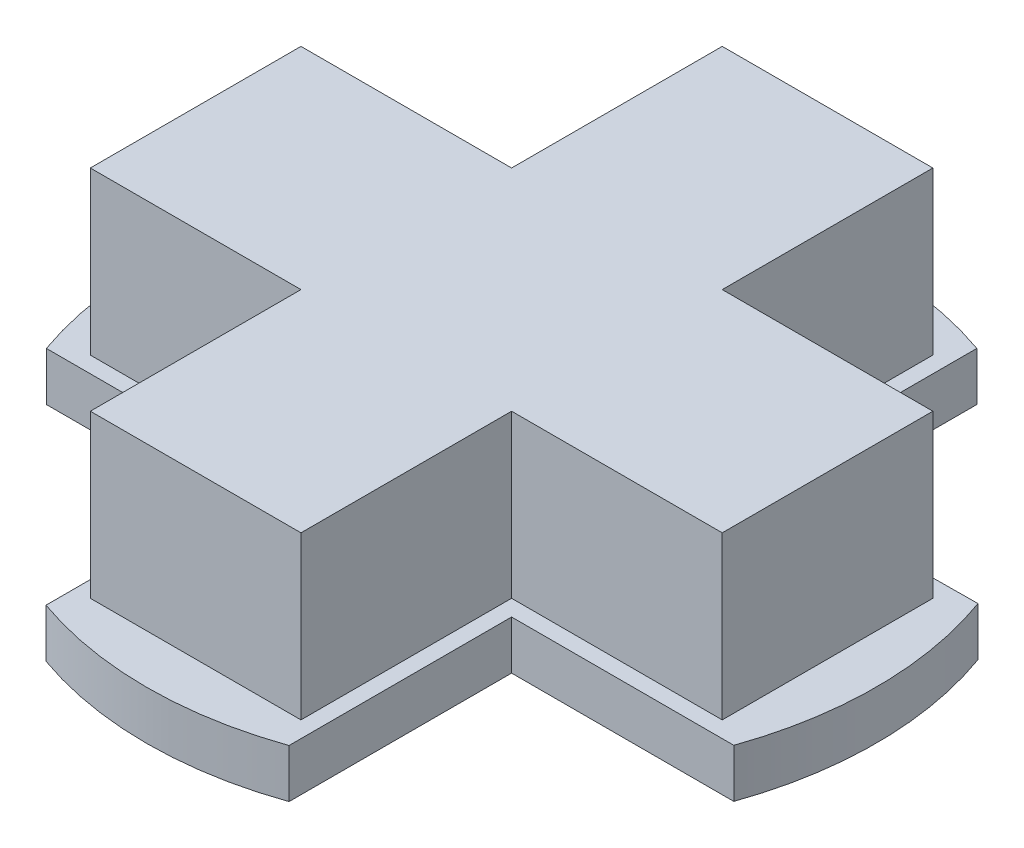
ISO-10303-21;
HEADER;
FILE_DESCRIPTION(('STEP AP214'),'2;1');
FILE_NAME('part.step','',(''),(''),'','','');
FILE_SCHEMA(('AUTOMOTIVE_DESIGN { 1 0 10303 214 1 1 1 1 }'));
ENDSEC;
DATA;
#1=APPLICATION_CONTEXT('core data for automotive mechanical design processes');
#2=APPLICATION_PROTOCOL_DEFINITION('international standard','automotive_design',2000,#1);
#3=PRODUCT_CONTEXT('',#1,'mechanical');
#4=PRODUCT('Part','Part','',(#3));
#5=PRODUCT_RELATED_PRODUCT_CATEGORY('part','',(#4));
#6=PRODUCT_DEFINITION_FORMATION('','',#4);
#7=PRODUCT_DEFINITION_CONTEXT('part definition',#1,'design');
#8=PRODUCT_DEFINITION('design','',#6,#7);
#9=PRODUCT_DEFINITION_SHAPE('','',#8);
#10=(LENGTH_UNIT() NAMED_UNIT(*) SI_UNIT(.MILLI.,.METRE.));
#11=(NAMED_UNIT(*) PLANE_ANGLE_UNIT() SI_UNIT($,.RADIAN.));
#12=(NAMED_UNIT(*) SI_UNIT($,.STERADIAN.) SOLID_ANGLE_UNIT());
#13=UNCERTAINTY_MEASURE_WITH_UNIT(LENGTH_MEASURE(1.E-05),#10,'distance_accuracy_value','');
#14=(GEOMETRIC_REPRESENTATION_CONTEXT(3) GLOBAL_UNCERTAINTY_ASSIGNED_CONTEXT((#13)) GLOBAL_UNIT_ASSIGNED_CONTEXT((#10,
#11,#12)) REPRESENTATION_CONTEXT('',''));
#15=CARTESIAN_POINT('',(0.,0.,0.));
#16=DIRECTION('',(0.,0.,1.));
#17=DIRECTION('',(1.,0.,0.));
#18=AXIS2_PLACEMENT_3D('',#15,#16,#17);
#19=CARTESIAN_POINT('',(0.,1.8,0.));
#20=DIRECTION('',(0.,1.,0.));
#21=DIRECTION('',(0.,0.,1.));
#22=AXIS2_PLACEMENT_3D('',#19,#20,#21);
#23=PLANE('',#22);
#24=CARTESIAN_POINT('',(0.,1.8,0.));
#25=DIRECTION('',(0.,1.,0.));
#26=DIRECTION('',(0.,0.,1.));
#27=AXIS2_PLACEMENT_3D('',#24,#25,#26);
#28=CIRCLE('',#27,13.5);
#29=CARTESIAN_POINT('',(-12.7279220613579,1.8,-4.5));
#30=VERTEX_POINT('',#29);
#31=CARTESIAN_POINT('',(-12.7279220613579,1.8,4.5));
#32=VERTEX_POINT('',#31);
#33=EDGE_CURVE('E109',#30,#32,#28,.T.);
#34=ORIENTED_EDGE('',*,*,#33,.T.);
#35=DIRECTION('',(-1.,0.,0.));
#36=VECTOR('',#35,1.);
#37=CARTESIAN_POINT('',(-4.5,1.8,4.5));
#38=LINE('',#37,#36);
#39=CARTESIAN_POINT('',(-4.5,1.8,4.5));
#40=VERTEX_POINT('',#39);
#41=EDGE_CURVE('E238',#40,#32,#38,.T.);
#42=ORIENTED_EDGE('',*,*,#41,.F.);
#43=DIRECTION('',(0.,0.,-1.));
#44=VECTOR('',#43,1.);
#45=CARTESIAN_POINT('',(-4.5,1.8,12.741400861865));
#46=LINE('',#45,#44);
#47=CARTESIAN_POINT('',(-4.50000000000001,1.8,12.741400861865));
#48=VERTEX_POINT('',#47);
#49=EDGE_CURVE('E221',#48,#40,#46,.T.);
#50=ORIENTED_EDGE('',*,*,#49,.F.);
#51=CARTESIAN_POINT('',(0.,1.8,0.));
#52=DIRECTION('',(0.,1.,0.));
#53=DIRECTION('',(0.,0.,1.));
#54=AXIS2_PLACEMENT_3D('',#51,#52,#53);
#55=CIRCLE('',#54,13.512708681931);
#56=CARTESIAN_POINT('',(4.5,1.8,12.741400861865));
#57=VERTEX_POINT('',#56);
#58=EDGE_CURVE('E234',#48,#57,#55,.T.);
#59=ORIENTED_EDGE('',*,*,#58,.T.);
#60=DIRECTION('',(0.,0.,1.));
#61=VECTOR('',#60,1.);
#62=CARTESIAN_POINT('',(4.5,1.8,4.5));
#63=LINE('',#62,#61);
#64=CARTESIAN_POINT('',(4.5,1.8,4.5));
#65=VERTEX_POINT('',#64);
#66=EDGE_CURVE('E236',#65,#57,#63,.T.);
#67=ORIENTED_EDGE('',*,*,#66,.F.);
#68=DIRECTION('',(-1.,0.,0.));
#69=VECTOR('',#68,1.);
#70=CARTESIAN_POINT('',(12.7279220613579,1.8,4.5));
#71=LINE('',#70,#69);
#72=CARTESIAN_POINT('',(12.7279220613579,1.8,4.5));
#73=VERTEX_POINT('',#72);
#74=EDGE_CURVE('E244',#73,#65,#71,.T.);
#75=ORIENTED_EDGE('',*,*,#74,.F.);
#76=CARTESIAN_POINT('',(0.,1.8,0.));
#77=DIRECTION('',(0.,1.,0.));
#78=DIRECTION('',(0.,0.,1.));
#79=AXIS2_PLACEMENT_3D('',#76,#77,#78);
#80=CIRCLE('',#79,13.5);
#81=CARTESIAN_POINT('',(12.7038365936549,1.8,-4.56755249578098));
#82=VERTEX_POINT('',#81);
#83=EDGE_CURVE('E247',#73,#82,#80,.T.);
#84=ORIENTED_EDGE('',*,*,#83,.T.);
#85=DIRECTION('',(0.999966100232827,0.,-0.00823397748065216));
#86=VECTOR('',#85,1.);
#87=CARTESIAN_POINT('',(4.5,1.8,-4.5));
#88=LINE('',#87,#86);
#89=CARTESIAN_POINT('',(4.5,1.8,-4.5));
#90=VERTEX_POINT('',#89);
#91=EDGE_CURVE('E249',#90,#82,#88,.T.);
#92=ORIENTED_EDGE('',*,*,#91,.F.);
#93=DIRECTION('',(0.,0.,1.));
#94=VECTOR('',#93,1.);
#95=CARTESIAN_POINT('',(4.5,1.8,-12.7279220613579));
#96=LINE('',#95,#94);
#97=CARTESIAN_POINT('',(4.5,1.8,-12.7279220613579));
#98=VERTEX_POINT('',#97);
#99=EDGE_CURVE('E148',#98,#90,#96,.T.);
#100=ORIENTED_EDGE('',*,*,#99,.F.);
#101=CARTESIAN_POINT('',(0.,1.8,0.));
#102=DIRECTION('',(0.,1.,0.));
#103=DIRECTION('',(0.,0.,1.));
#104=AXIS2_PLACEMENT_3D('',#101,#102,#103);
#105=CIRCLE('',#104,13.5);
#106=CARTESIAN_POINT('',(-4.5,1.8,-12.7279220613579));
#107=VERTEX_POINT('',#106);
#108=EDGE_CURVE('E141',#98,#107,#105,.T.);
#109=ORIENTED_EDGE('',*,*,#108,.T.);
#110=DIRECTION('',(0.,0.,-1.));
#111=VECTOR('',#110,1.);
#112=CARTESIAN_POINT('',(-4.5,1.8,-4.5));
#113=LINE('',#112,#111);
#114=CARTESIAN_POINT('',(-4.5,1.8,-4.5));
#115=VERTEX_POINT('',#114);
#116=EDGE_CURVE('E145',#115,#107,#113,.T.);
#117=ORIENTED_EDGE('',*,*,#116,.F.);
#118=DIRECTION('',(1.,0.,0.));
#119=VECTOR('',#118,1.);
#120=CARTESIAN_POINT('',(-12.7279220613579,1.8,-4.5));
#121=LINE('',#120,#119);
#122=EDGE_CURVE('E163',#30,#115,#121,.T.);
#123=ORIENTED_EDGE('',*,*,#122,.F.);
#124=EDGE_LOOP('',(#34,#42,#50,#59,#67,#75,#84,#92,#100,#109,#117,#123));
#125=FACE_BOUND('',#124,.T.);
#126=DIRECTION('',(1.,0.,0.));
#127=VECTOR('',#126,1.);
#128=CARTESIAN_POINT('',(3.9,1.8,3.9));
#129=LINE('',#128,#127);
#130=CARTESIAN_POINT('',(3.9,1.8,3.9));
#131=VERTEX_POINT('',#130);
#132=CARTESIAN_POINT('',(11.7,1.8,3.9));
#133=VERTEX_POINT('',#132);
#134=EDGE_CURVE('E407',#131,#133,#129,.T.);
#135=ORIENTED_EDGE('',*,*,#134,.F.);
#136=DIRECTION('',(0.,0.,-1.));
#137=VECTOR('',#136,1.);
#138=CARTESIAN_POINT('',(3.9,1.8,11.7));
#139=LINE('',#138,#137);
#140=CARTESIAN_POINT('',(3.9,1.8,11.7));
#141=VERTEX_POINT('',#140);
#142=EDGE_CURVE('E345',#141,#131,#139,.T.);
#143=ORIENTED_EDGE('',*,*,#142,.F.);
#144=DIRECTION('',(1.,0.,0.));
#145=VECTOR('',#144,1.);
#146=CARTESIAN_POINT('',(3.9,1.8,11.7));
#147=LINE('',#146,#145);
#148=CARTESIAN_POINT('',(-3.9,1.8,11.7));
#149=VERTEX_POINT('',#148);
#150=EDGE_CURVE('E339',#149,#141,#147,.T.);
#151=ORIENTED_EDGE('',*,*,#150,.F.);
#152=DIRECTION('',(0.,0.,1.));
#153=VECTOR('',#152,1.);
#154=CARTESIAN_POINT('',(-3.9,1.8,3.9));
#155=LINE('',#154,#153);
#156=CARTESIAN_POINT('',(-3.9,1.8,3.9));
#157=VERTEX_POINT('',#156);
#158=EDGE_CURVE('E381',#157,#149,#155,.T.);
#159=ORIENTED_EDGE('',*,*,#158,.F.);
#160=DIRECTION('',(1.,0.,0.));
#161=VECTOR('',#160,1.);
#162=CARTESIAN_POINT('',(-11.7,1.8,3.9));
#163=LINE('',#162,#161);
#164=CARTESIAN_POINT('',(-11.7,1.8,3.9));
#165=VERTEX_POINT('',#164);
#166=EDGE_CURVE('E383',#165,#157,#163,.T.);
#167=ORIENTED_EDGE('',*,*,#166,.F.);
#168=DIRECTION('',(0.,0.,1.));
#169=VECTOR('',#168,1.);
#170=CARTESIAN_POINT('',(-11.7,1.8,3.9));
#171=LINE('',#170,#169);
#172=CARTESIAN_POINT('',(-11.7,1.8,-3.9));
#173=VERTEX_POINT('',#172);
#174=EDGE_CURVE('E386',#173,#165,#171,.T.);
#175=ORIENTED_EDGE('',*,*,#174,.F.);
#176=DIRECTION('',(-1.,0.,0.));
#177=VECTOR('',#176,1.);
#178=CARTESIAN_POINT('',(-3.9,1.8,-3.9));
#179=LINE('',#178,#177);
#180=CARTESIAN_POINT('',(-3.9,1.8,-3.9));
#181=VERTEX_POINT('',#180);
#182=EDGE_CURVE('E389',#181,#173,#179,.T.);
#183=ORIENTED_EDGE('',*,*,#182,.F.);
#184=DIRECTION('',(0.,0.,1.));
#185=VECTOR('',#184,1.);
#186=CARTESIAN_POINT('',(-3.9,1.8,-11.7));
#187=LINE('',#186,#185);
#188=CARTESIAN_POINT('',(-3.9,1.8,-11.7));
#189=VERTEX_POINT('',#188);
#190=EDGE_CURVE('E392',#189,#181,#187,.T.);
#191=ORIENTED_EDGE('',*,*,#190,.F.);
#192=DIRECTION('',(-1.,0.,0.));
#193=VECTOR('',#192,1.);
#194=CARTESIAN_POINT('',(-3.9,1.8,-11.7));
#195=LINE('',#194,#193);
#196=CARTESIAN_POINT('',(3.9,1.8,-11.7));
#197=VERTEX_POINT('',#196);
#198=EDGE_CURVE('E395',#197,#189,#195,.T.);
#199=ORIENTED_EDGE('',*,*,#198,.F.);
#200=DIRECTION('',(0.,0.,-1.));
#201=VECTOR('',#200,1.);
#202=CARTESIAN_POINT('',(3.9,1.8,-3.9));
#203=LINE('',#202,#201);
#204=CARTESIAN_POINT('',(3.9,1.8,-3.9));
#205=VERTEX_POINT('',#204);
#206=EDGE_CURVE('E398',#205,#197,#203,.T.);
#207=ORIENTED_EDGE('',*,*,#206,.F.);
#208=DIRECTION('',(-1.,0.,0.));
#209=VECTOR('',#208,1.);
#210=CARTESIAN_POINT('',(11.7,1.8,-3.9));
#211=LINE('',#210,#209);
#212=CARTESIAN_POINT('',(11.7,1.8,-3.9));
#213=VERTEX_POINT('',#212);
#214=EDGE_CURVE('E401',#213,#205,#211,.T.);
#215=ORIENTED_EDGE('',*,*,#214,.F.);
#216=DIRECTION('',(0.,0.,-1.));
#217=VECTOR('',#216,1.);
#218=CARTESIAN_POINT('',(11.7,1.8,-3.9));
#219=LINE('',#218,#217);
#220=EDGE_CURVE('E404',#133,#213,#219,.T.);
#221=ORIENTED_EDGE('',*,*,#220,.F.);
#222=EDGE_LOOP('',(#135,#143,#151,#159,#167,#175,#183,#191,#199,#207,#215,#221));
#223=FACE_BOUND('',#222,.T.);
#224=ADVANCED_FACE('F35',(#125,#223),#23,.T.);
#225=CARTESIAN_POINT('',(0.,1.8,0.));
#226=DIRECTION('',(0.,-1.,0.));
#227=DIRECTION('',(0.,0.,-1.));
#228=AXIS2_PLACEMENT_3D('',#225,#226,#227);
#229=CYLINDRICAL_SURFACE('',#228,13.5);
#230=CARTESIAN_POINT('',(0.,0.,0.));
#231=DIRECTION('',(0.,1.,0.));
#232=DIRECTION('',(0.,0.,1.));
#233=AXIS2_PLACEMENT_3D('',#230,#231,#232);
#234=CIRCLE('',#233,13.5);
#235=CARTESIAN_POINT('',(-12.7279220613579,0.,-4.5));
#236=VERTEX_POINT('',#235);
#237=CARTESIAN_POINT('',(-12.7279220613579,0.,4.5));
#238=VERTEX_POINT('',#237);
#239=EDGE_CURVE('E168',#236,#238,#234,.T.);
#240=ORIENTED_EDGE('',*,*,#239,.T.);
#241=DIRECTION('',(0.,-1.,0.));
#242=VECTOR('',#241,1.);
#243=CARTESIAN_POINT('',(-12.7279220613579,1.8,4.5));
#244=LINE('',#243,#242);
#245=EDGE_CURVE('E11',#32,#238,#244,.T.);
#246=ORIENTED_EDGE('',*,*,#245,.F.);
#247=ORIENTED_EDGE('',*,*,#33,.F.);
#248=DIRECTION('',(0.,-1.,0.));
#249=VECTOR('',#248,1.);
#250=CARTESIAN_POINT('',(-12.7279220613579,1.8,-4.5));
#251=LINE('',#250,#249);
#252=EDGE_CURVE('E59',#30,#236,#251,.T.);
#253=ORIENTED_EDGE('',*,*,#252,.T.);
#254=EDGE_LOOP('',(#240,#246,#247,#253));
#255=FACE_BOUND('',#254,.T.);
#256=ADVANCED_FACE('F37',(#255),#229,.T.);
#257=CARTESIAN_POINT('',(-4.5,1.8,4.5));
#258=DIRECTION('',(0.,0.,1.));
#259=DIRECTION('',(1.,0.,0.));
#260=AXIS2_PLACEMENT_3D('',#257,#258,#259);
#261=PLANE('',#260);
#262=DIRECTION('',(-1.,0.,0.));
#263=VECTOR('',#262,1.);
#264=CARTESIAN_POINT('',(-4.5,0.,4.5));
#265=LINE('',#264,#263);
#266=CARTESIAN_POINT('',(-4.5,0.,4.5));
#267=VERTEX_POINT('',#266);
#268=EDGE_CURVE('E170',#267,#238,#265,.T.);
#269=ORIENTED_EDGE('',*,*,#268,.F.);
#270=DIRECTION('',(0.,-1.,0.));
#271=VECTOR('',#270,1.);
#272=CARTESIAN_POINT('',(-4.5,1.8,4.5));
#273=LINE('',#272,#271);
#274=EDGE_CURVE('E43',#40,#267,#273,.T.);
#275=ORIENTED_EDGE('',*,*,#274,.F.);
#276=ORIENTED_EDGE('',*,*,#41,.T.);
#277=ORIENTED_EDGE('',*,*,#245,.T.);
#278=EDGE_LOOP('',(#269,#275,#276,#277));
#279=FACE_BOUND('',#278,.T.);
#280=ADVANCED_FACE('F224',(#279),#261,.T.);
#281=CARTESIAN_POINT('',(-4.5,1.8,12.741400861865));
#282=DIRECTION('',(-1.,0.,0.));
#283=DIRECTION('',(0.,0.,1.));
#284=AXIS2_PLACEMENT_3D('',#281,#282,#283);
#285=PLANE('',#284);
#286=DIRECTION('',(0.,0.,-1.));
#287=VECTOR('',#286,1.);
#288=CARTESIAN_POINT('',(-4.5,0.,12.741400861865));
#289=LINE('',#288,#287);
#290=CARTESIAN_POINT('',(-4.50000000000001,0.,12.741400861865));
#291=VERTEX_POINT('',#290);
#292=EDGE_CURVE('E174',#291,#267,#289,.T.);
#293=ORIENTED_EDGE('',*,*,#292,.F.);
#294=DIRECTION('',(0.,-1.,0.));
#295=VECTOR('',#294,1.);
#296=CARTESIAN_POINT('',(-4.50000000000001,1.8,12.741400861865));
#297=LINE('',#296,#295);
#298=EDGE_CURVE('E214',#48,#291,#297,.T.);
#299=ORIENTED_EDGE('',*,*,#298,.F.);
#300=ORIENTED_EDGE('',*,*,#49,.T.);
#301=ORIENTED_EDGE('',*,*,#274,.T.);
#302=EDGE_LOOP('',(#293,#299,#300,#301));
#303=FACE_BOUND('',#302,.T.);
#304=ADVANCED_FACE('F219',(#303),#285,.T.);
#305=CARTESIAN_POINT('',(0.,1.8,0.));
#306=DIRECTION('',(0.,-1.,0.));
#307=DIRECTION('',(0.,0.,-1.));
#308=AXIS2_PLACEMENT_3D('',#305,#306,#307);
#309=CYLINDRICAL_SURFACE('',#308,13.512708681931);
#310=CARTESIAN_POINT('',(0.,0.,0.));
#311=DIRECTION('',(0.,1.,0.));
#312=DIRECTION('',(0.,0.,1.));
#313=AXIS2_PLACEMENT_3D('',#310,#311,#312);
#314=CIRCLE('',#313,13.512708681931);
#315=CARTESIAN_POINT('',(4.5,0.,12.741400861865));
#316=VERTEX_POINT('',#315);
#317=EDGE_CURVE('E177',#291,#316,#314,.T.);
#318=ORIENTED_EDGE('',*,*,#317,.T.);
#319=DIRECTION('',(0.,-1.,0.));
#320=VECTOR('',#319,1.);
#321=CARTESIAN_POINT('',(4.5,1.8,12.741400861865));
#322=LINE('',#321,#320);
#323=EDGE_CURVE('E212',#57,#316,#322,.T.);
#324=ORIENTED_EDGE('',*,*,#323,.F.);
#325=ORIENTED_EDGE('',*,*,#58,.F.);
#326=ORIENTED_EDGE('',*,*,#298,.T.);
#327=EDGE_LOOP('',(#318,#324,#325,#326));
#328=FACE_BOUND('',#327,.T.);
#329=ADVANCED_FACE('F231',(#328),#309,.T.);
#330=CARTESIAN_POINT('',(4.5,1.8,4.5));
#331=DIRECTION('',(1.,0.,0.));
#332=DIRECTION('',(0.,0.,-1.));
#333=AXIS2_PLACEMENT_3D('',#330,#331,#332);
#334=PLANE('',#333);
#335=DIRECTION('',(0.,0.,1.));
#336=VECTOR('',#335,1.);
#337=CARTESIAN_POINT('',(4.5,0.,4.5));
#338=LINE('',#337,#336);
#339=CARTESIAN_POINT('',(4.5,0.,4.5));
#340=VERTEX_POINT('',#339);
#341=EDGE_CURVE('E180',#340,#316,#338,.T.);
#342=ORIENTED_EDGE('',*,*,#341,.F.);
#343=DIRECTION('',(0.,-1.,0.));
#344=VECTOR('',#343,1.);
#345=CARTESIAN_POINT('',(4.5,1.8,4.5));
#346=LINE('',#345,#344);
#347=EDGE_CURVE('E210',#65,#340,#346,.T.);
#348=ORIENTED_EDGE('',*,*,#347,.F.);
#349=ORIENTED_EDGE('',*,*,#66,.T.);
#350=ORIENTED_EDGE('',*,*,#323,.T.);
#351=EDGE_LOOP('',(#342,#348,#349,#350));
#352=FACE_BOUND('',#351,.T.);
#353=ADVANCED_FACE('F639',(#352),#334,.T.);
#354=CARTESIAN_POINT('',(12.7279220613579,1.8,4.5));
#355=DIRECTION('',(0.,0.,1.));
#356=DIRECTION('',(1.,0.,0.));
#357=AXIS2_PLACEMENT_3D('',#354,#355,#356);
#358=PLANE('',#357);
#359=DIRECTION('',(-1.,0.,0.));
#360=VECTOR('',#359,1.);
#361=CARTESIAN_POINT('',(12.7279220613579,0.,4.5));
#362=LINE('',#361,#360);
#363=CARTESIAN_POINT('',(12.7279220613579,0.,4.5));
#364=VERTEX_POINT('',#363);
#365=EDGE_CURVE('E183',#364,#340,#362,.T.);
#366=ORIENTED_EDGE('',*,*,#365,.F.);
#367=DIRECTION('',(0.,-1.,0.));
#368=VECTOR('',#367,1.);
#369=CARTESIAN_POINT('',(12.7279220613579,1.8,4.5));
#370=LINE('',#369,#368);
#371=EDGE_CURVE('E208',#73,#364,#370,.T.);
#372=ORIENTED_EDGE('',*,*,#371,.F.);
#373=ORIENTED_EDGE('',*,*,#74,.T.);
#374=ORIENTED_EDGE('',*,*,#347,.T.);
#375=EDGE_LOOP('',(#366,#372,#373,#374));
#376=FACE_BOUND('',#375,.T.);
#377=ADVANCED_FACE('F629',(#376),#358,.T.);
#378=CARTESIAN_POINT('',(0.,1.8,0.));
#379=DIRECTION('',(0.,-1.,0.));
#380=DIRECTION('',(0.,0.,-1.));
#381=AXIS2_PLACEMENT_3D('',#378,#379,#380);
#382=CYLINDRICAL_SURFACE('',#381,13.5);
#383=CARTESIAN_POINT('',(0.,0.,0.));
#384=DIRECTION('',(0.,1.,0.));
#385=DIRECTION('',(0.,0.,1.));
#386=AXIS2_PLACEMENT_3D('',#383,#384,#385);
#387=CIRCLE('',#386,13.5);
#388=CARTESIAN_POINT('',(12.7038365936549,0.,-4.56755249578098));
#389=VERTEX_POINT('',#388);
#390=EDGE_CURVE('E186',#364,#389,#387,.T.);
#391=ORIENTED_EDGE('',*,*,#390,.T.);
#392=DIRECTION('',(0.,-1.,0.));
#393=VECTOR('',#392,1.);
#394=CARTESIAN_POINT('',(12.7038365936549,1.8,-4.56755249578098));
#395=LINE('',#394,#393);
#396=EDGE_CURVE('E206',#82,#389,#395,.T.);
#397=ORIENTED_EDGE('',*,*,#396,.F.);
#398=ORIENTED_EDGE('',*,*,#83,.F.);
#399=ORIENTED_EDGE('',*,*,#371,.T.);
#400=EDGE_LOOP('',(#391,#397,#398,#399));
#401=FACE_BOUND('',#400,.T.);
#402=ADVANCED_FACE('F619',(#401),#382,.T.);
#403=CARTESIAN_POINT('',(4.5,1.8,-4.5));
#404=DIRECTION('',(-0.00823397748065216,0.,-0.999966100232827));
#405=DIRECTION('',(-0.999966100232827,0.,0.00823397748065216));
#406=AXIS2_PLACEMENT_3D('',#403,#404,#405);
#407=PLANE('',#406);
#408=DIRECTION('',(0.999966100232827,0.,-0.00823397748065216));
#409=VECTOR('',#408,1.);
#410=CARTESIAN_POINT('',(4.5,0.,-4.5));
#411=LINE('',#410,#409);
#412=CARTESIAN_POINT('',(4.5,0.,-4.5));
#413=VERTEX_POINT('',#412);
#414=EDGE_CURVE('E189',#413,#389,#411,.T.);
#415=ORIENTED_EDGE('',*,*,#414,.F.);
#416=DIRECTION('',(0.,-1.,0.));
#417=VECTOR('',#416,1.);
#418=CARTESIAN_POINT('',(4.5,1.8,-4.5));
#419=LINE('',#418,#417);
#420=EDGE_CURVE('E204',#90,#413,#419,.T.);
#421=ORIENTED_EDGE('',*,*,#420,.F.);
#422=ORIENTED_EDGE('',*,*,#91,.T.);
#423=ORIENTED_EDGE('',*,*,#396,.T.);
#424=EDGE_LOOP('',(#415,#421,#422,#423));
#425=FACE_BOUND('',#424,.T.);
#426=ADVANCED_FACE('F610',(#425),#407,.T.);
#427=CARTESIAN_POINT('',(4.5,1.8,-12.7279220613579));
#428=DIRECTION('',(1.,0.,0.));
#429=DIRECTION('',(0.,0.,-1.));
#430=AXIS2_PLACEMENT_3D('',#427,#428,#429);
#431=PLANE('',#430);
#432=DIRECTION('',(0.,0.,1.));
#433=VECTOR('',#432,1.);
#434=CARTESIAN_POINT('',(4.5,0.,-12.7279220613579));
#435=LINE('',#434,#433);
#436=CARTESIAN_POINT('',(4.5,0.,-12.7279220613579));
#437=VERTEX_POINT('',#436);
#438=EDGE_CURVE('E192',#437,#413,#435,.T.);
#439=ORIENTED_EDGE('',*,*,#438,.F.);
#440=DIRECTION('',(0.,-1.,0.));
#441=VECTOR('',#440,1.);
#442=CARTESIAN_POINT('',(4.5,1.8,-12.7279220613579));
#443=LINE('',#442,#441);
#444=EDGE_CURVE('E159',#98,#437,#443,.T.);
#445=ORIENTED_EDGE('',*,*,#444,.F.);
#446=ORIENTED_EDGE('',*,*,#99,.T.);
#447=ORIENTED_EDGE('',*,*,#420,.T.);
#448=EDGE_LOOP('',(#439,#445,#446,#447));
#449=FACE_BOUND('',#448,.T.);
#450=ADVANCED_FACE('F253',(#449),#431,.T.);
#451=CARTESIAN_POINT('',(0.,1.8,0.));
#452=DIRECTION('',(0.,-1.,0.));
#453=DIRECTION('',(0.,0.,-1.));
#454=AXIS2_PLACEMENT_3D('',#451,#452,#453);
#455=CYLINDRICAL_SURFACE('',#454,13.5);
#456=CARTESIAN_POINT('',(0.,0.,0.));
#457=DIRECTION('',(0.,1.,0.));
#458=DIRECTION('',(0.,0.,1.));
#459=AXIS2_PLACEMENT_3D('',#456,#457,#458);
#460=CIRCLE('',#459,13.5);
#461=CARTESIAN_POINT('',(-4.5,0.,-12.7279220613579));
#462=VERTEX_POINT('',#461);
#463=EDGE_CURVE('E155',#437,#462,#460,.T.);
#464=ORIENTED_EDGE('',*,*,#463,.T.);
#465=DIRECTION('',(0.,-1.,0.));
#466=VECTOR('',#465,1.);
#467=CARTESIAN_POINT('',(-4.5,1.8,-12.7279220613579));
#468=LINE('',#467,#466);
#469=EDGE_CURVE('E152',#107,#462,#468,.T.);
#470=ORIENTED_EDGE('',*,*,#469,.F.);
#471=ORIENTED_EDGE('',*,*,#108,.F.);
#472=ORIENTED_EDGE('',*,*,#444,.T.);
#473=EDGE_LOOP('',(#464,#470,#471,#472));
#474=FACE_BOUND('',#473,.T.);
#475=ADVANCED_FACE('F153',(#474),#455,.T.);
#476=CARTESIAN_POINT('',(-4.5,1.8,-4.5));
#477=DIRECTION('',(-1.,0.,0.));
#478=DIRECTION('',(0.,0.,1.));
#479=AXIS2_PLACEMENT_3D('',#476,#477,#478);
#480=PLANE('',#479);
#481=DIRECTION('',(0.,0.,-1.));
#482=VECTOR('',#481,1.);
#483=CARTESIAN_POINT('',(-4.5,0.,-4.5));
#484=LINE('',#483,#482);
#485=CARTESIAN_POINT('',(-4.5,0.,-4.5));
#486=VERTEX_POINT('',#485);
#487=EDGE_CURVE('E196',#486,#462,#484,.T.);
#488=ORIENTED_EDGE('',*,*,#487,.F.);
#489=DIRECTION('',(0.,-1.,0.));
#490=VECTOR('',#489,1.);
#491=CARTESIAN_POINT('',(-4.5,1.8,-4.5));
#492=LINE('',#491,#490);
#493=EDGE_CURVE('E160',#115,#486,#492,.T.);
#494=ORIENTED_EDGE('',*,*,#493,.F.);
#495=ORIENTED_EDGE('',*,*,#116,.T.);
#496=ORIENTED_EDGE('',*,*,#469,.T.);
#497=EDGE_LOOP('',(#488,#494,#495,#496));
#498=FACE_BOUND('',#497,.T.);
#499=ADVANCED_FACE('F162',(#498),#480,.T.);
#500=CARTESIAN_POINT('',(-12.7279220613579,1.8,-4.5));
#501=DIRECTION('',(0.,0.,-1.));
#502=DIRECTION('',(-1.,0.,0.));
#503=AXIS2_PLACEMENT_3D('',#500,#501,#502);
#504=PLANE('',#503);
#505=DIRECTION('',(1.,0.,0.));
#506=VECTOR('',#505,1.);
#507=CARTESIAN_POINT('',(-12.7279220613579,0.,-4.5));
#508=LINE('',#507,#506);
#509=EDGE_CURVE('E198',#236,#486,#508,.T.);
#510=ORIENTED_EDGE('',*,*,#509,.F.);
#511=ORIENTED_EDGE('',*,*,#252,.F.);
#512=ORIENTED_EDGE('',*,*,#122,.T.);
#513=ORIENTED_EDGE('',*,*,#493,.T.);
#514=EDGE_LOOP('',(#510,#511,#512,#513));
#515=FACE_BOUND('',#514,.T.);
#516=ADVANCED_FACE('F255',(#515),#504,.T.);
#517=CARTESIAN_POINT('',(0.,0.,0.));
#518=DIRECTION('',(0.,1.,0.));
#519=DIRECTION('',(0.,0.,1.));
#520=AXIS2_PLACEMENT_3D('',#517,#518,#519);
#521=PLANE('',#520);
#522=ORIENTED_EDGE('',*,*,#239,.F.);
#523=ORIENTED_EDGE('',*,*,#509,.T.);
#524=ORIENTED_EDGE('',*,*,#487,.T.);
#525=ORIENTED_EDGE('',*,*,#463,.F.);
#526=ORIENTED_EDGE('',*,*,#438,.T.);
#527=ORIENTED_EDGE('',*,*,#414,.T.);
#528=ORIENTED_EDGE('',*,*,#390,.F.);
#529=ORIENTED_EDGE('',*,*,#365,.T.);
#530=ORIENTED_EDGE('',*,*,#341,.T.);
#531=ORIENTED_EDGE('',*,*,#317,.F.);
#532=ORIENTED_EDGE('',*,*,#292,.T.);
#533=ORIENTED_EDGE('',*,*,#268,.T.);
#534=EDGE_LOOP('',(#522,#523,#524,#525,#526,#527,#528,#529,#530,#531,#532,#533));
#535=FACE_BOUND('',#534,.T.);
#536=ADVANCED_FACE('F227',(#535),#521,.F.);
#537=CARTESIAN_POINT('',(3.9,7.8,11.7));
#538=DIRECTION('',(-1.,0.,0.));
#539=DIRECTION('',(0.,0.,1.));
#540=AXIS2_PLACEMENT_3D('',#537,#538,#539);
#541=PLANE('',#540);
#542=ORIENTED_EDGE('',*,*,#142,.T.);
#543=DIRECTION('',(0.,-1.,0.));
#544=VECTOR('',#543,1.);
#545=CARTESIAN_POINT('',(3.9,7.8,3.9));
#546=LINE('',#545,#544);
#547=CARTESIAN_POINT('',(3.9,7.8,3.9));
#548=VERTEX_POINT('',#547);
#549=EDGE_CURVE('E171',#548,#131,#546,.T.);
#550=ORIENTED_EDGE('',*,*,#549,.F.);
#551=DIRECTION('',(0.,0.,-1.));
#552=VECTOR('',#551,1.);
#553=CARTESIAN_POINT('',(3.9,7.8,11.7));
#554=LINE('',#553,#552);
#555=CARTESIAN_POINT('',(3.9,7.8,11.7));
#556=VERTEX_POINT('',#555);
#557=EDGE_CURVE('E327',#556,#548,#554,.T.);
#558=ORIENTED_EDGE('',*,*,#557,.F.);
#559=DIRECTION('',(0.,-1.,0.));
#560=VECTOR('',#559,1.);
#561=CARTESIAN_POINT('',(3.9,7.8,11.7));
#562=LINE('',#561,#560);
#563=EDGE_CURVE('E378',#556,#141,#562,.T.);
#564=ORIENTED_EDGE('',*,*,#563,.T.);
#565=EDGE_LOOP('',(#542,#550,#558,#564));
#566=FACE_BOUND('',#565,.T.);
#567=ADVANCED_FACE('F262',(#566),#541,.F.);
#568=CARTESIAN_POINT('',(3.9,7.8,3.9));
#569=DIRECTION('',(0.,0.,-1.));
#570=DIRECTION('',(-1.,0.,0.));
#571=AXIS2_PLACEMENT_3D('',#568,#569,#570);
#572=PLANE('',#571);
#573=ORIENTED_EDGE('',*,*,#134,.T.);
#574=DIRECTION('',(0.,-1.,0.));
#575=VECTOR('',#574,1.);
#576=CARTESIAN_POINT('',(11.7,7.8,3.9));
#577=LINE('',#576,#575);
#578=CARTESIAN_POINT('',(11.7,7.8,3.9));
#579=VERTEX_POINT('',#578);
#580=EDGE_CURVE('E348',#579,#133,#577,.T.);
#581=ORIENTED_EDGE('',*,*,#580,.F.);
#582=DIRECTION('',(1.,0.,0.));
#583=VECTOR('',#582,1.);
#584=CARTESIAN_POINT('',(3.9,7.8,3.9));
#585=LINE('',#584,#583);
#586=EDGE_CURVE('E332',#548,#579,#585,.T.);
#587=ORIENTED_EDGE('',*,*,#586,.F.);
#588=ORIENTED_EDGE('',*,*,#549,.T.);
#589=EDGE_LOOP('',(#573,#581,#587,#588));
#590=FACE_BOUND('',#589,.T.);
#591=ADVANCED_FACE('F273',(#590),#572,.F.);
#592=CARTESIAN_POINT('',(11.7,7.8,-3.9));
#593=DIRECTION('',(-1.,0.,0.));
#594=DIRECTION('',(0.,0.,1.));
#595=AXIS2_PLACEMENT_3D('',#592,#593,#594);
#596=PLANE('',#595);
#597=ORIENTED_EDGE('',*,*,#220,.T.);
#598=DIRECTION('',(0.,-1.,0.));
#599=VECTOR('',#598,1.);
#600=CARTESIAN_POINT('',(11.7,7.8,-3.9));
#601=LINE('',#600,#599);
#602=CARTESIAN_POINT('',(11.7,7.8,-3.9));
#603=VERTEX_POINT('',#602);
#604=EDGE_CURVE('E351',#603,#213,#601,.T.);
#605=ORIENTED_EDGE('',*,*,#604,.F.);
#606=DIRECTION('',(0.,0.,-1.));
#607=VECTOR('',#606,1.);
#608=CARTESIAN_POINT('',(11.7,7.8,-3.9));
#609=LINE('',#608,#607);
#610=EDGE_CURVE('E434',#579,#603,#609,.T.);
#611=ORIENTED_EDGE('',*,*,#610,.F.);
#612=ORIENTED_EDGE('',*,*,#580,.T.);
#613=EDGE_LOOP('',(#597,#605,#611,#612));
#614=FACE_BOUND('',#613,.T.);
#615=ADVANCED_FACE('F277',(#614),#596,.F.);
#616=CARTESIAN_POINT('',(11.7,7.8,-3.9));
#617=DIRECTION('',(0.,0.,1.));
#618=DIRECTION('',(1.,0.,0.));
#619=AXIS2_PLACEMENT_3D('',#616,#617,#618);
#620=PLANE('',#619);
#621=ORIENTED_EDGE('',*,*,#214,.T.);
#622=DIRECTION('',(0.,-1.,0.));
#623=VECTOR('',#622,1.);
#624=CARTESIAN_POINT('',(3.9,7.8,-3.9));
#625=LINE('',#624,#623);
#626=CARTESIAN_POINT('',(3.9,7.8,-3.9));
#627=VERTEX_POINT('',#626);
#628=EDGE_CURVE('E356',#627,#205,#625,.T.);
#629=ORIENTED_EDGE('',*,*,#628,.F.);
#630=DIRECTION('',(-1.,0.,0.));
#631=VECTOR('',#630,1.);
#632=CARTESIAN_POINT('',(11.7,7.8,-3.9));
#633=LINE('',#632,#631);
#634=EDGE_CURVE('E431',#603,#627,#633,.T.);
#635=ORIENTED_EDGE('',*,*,#634,.F.);
#636=ORIENTED_EDGE('',*,*,#604,.T.);
#637=EDGE_LOOP('',(#621,#629,#635,#636));
#638=FACE_BOUND('',#637,.T.);
#639=ADVANCED_FACE('F281',(#638),#620,.F.);
#640=CARTESIAN_POINT('',(3.9,7.8,-3.9));
#641=DIRECTION('',(-1.,0.,0.));
#642=DIRECTION('',(0.,0.,1.));
#643=AXIS2_PLACEMENT_3D('',#640,#641,#642);
#644=PLANE('',#643);
#645=ORIENTED_EDGE('',*,*,#206,.T.);
#646=DIRECTION('',(0.,-1.,0.));
#647=VECTOR('',#646,1.);
#648=CARTESIAN_POINT('',(3.9,7.8,-11.7));
#649=LINE('',#648,#647);
#650=CARTESIAN_POINT('',(3.9,7.8,-11.7));
#651=VERTEX_POINT('',#650);
#652=EDGE_CURVE('E359',#651,#197,#649,.T.);
#653=ORIENTED_EDGE('',*,*,#652,.F.);
#654=DIRECTION('',(0.,0.,-1.));
#655=VECTOR('',#654,1.);
#656=CARTESIAN_POINT('',(3.9,7.8,-3.9));
#657=LINE('',#656,#655);
#658=EDGE_CURVE('E428',#627,#651,#657,.T.);
#659=ORIENTED_EDGE('',*,*,#658,.F.);
#660=ORIENTED_EDGE('',*,*,#628,.T.);
#661=EDGE_LOOP('',(#645,#653,#659,#660));
#662=FACE_BOUND('',#661,.T.);
#663=ADVANCED_FACE('F285',(#662),#644,.F.);
#664=CARTESIAN_POINT('',(-3.9,7.8,-11.7));
#665=DIRECTION('',(0.,0.,1.));
#666=DIRECTION('',(1.,0.,0.));
#667=AXIS2_PLACEMENT_3D('',#664,#665,#666);
#668=PLANE('',#667);
#669=ORIENTED_EDGE('',*,*,#198,.T.);
#670=DIRECTION('',(0.,-1.,0.));
#671=VECTOR('',#670,1.);
#672=CARTESIAN_POINT('',(-3.9,7.8,-11.7));
#673=LINE('',#672,#671);
#674=CARTESIAN_POINT('',(-3.9,7.8,-11.7));
#675=VERTEX_POINT('',#674);
#676=EDGE_CURVE('E362',#675,#189,#673,.T.);
#677=ORIENTED_EDGE('',*,*,#676,.F.);
#678=DIRECTION('',(-1.,0.,0.));
#679=VECTOR('',#678,1.);
#680=CARTESIAN_POINT('',(-3.9,7.8,-11.7));
#681=LINE('',#680,#679);
#682=EDGE_CURVE('E425',#651,#675,#681,.T.);
#683=ORIENTED_EDGE('',*,*,#682,.F.);
#684=ORIENTED_EDGE('',*,*,#652,.T.);
#685=EDGE_LOOP('',(#669,#677,#683,#684));
#686=FACE_BOUND('',#685,.T.);
#687=ADVANCED_FACE('F289',(#686),#668,.F.);
#688=CARTESIAN_POINT('',(-3.9,7.8,-11.7));
#689=DIRECTION('',(1.,0.,0.));
#690=DIRECTION('',(0.,0.,-1.));
#691=AXIS2_PLACEMENT_3D('',#688,#689,#690);
#692=PLANE('',#691);
#693=ORIENTED_EDGE('',*,*,#190,.T.);
#694=DIRECTION('',(0.,-1.,0.));
#695=VECTOR('',#694,1.);
#696=CARTESIAN_POINT('',(-3.9,7.8,-3.9));
#697=LINE('',#696,#695);
#698=CARTESIAN_POINT('',(-3.9,7.8,-3.9));
#699=VERTEX_POINT('',#698);
#700=EDGE_CURVE('E365',#699,#181,#697,.T.);
#701=ORIENTED_EDGE('',*,*,#700,.F.);
#702=DIRECTION('',(0.,0.,1.));
#703=VECTOR('',#702,1.);
#704=CARTESIAN_POINT('',(-3.9,7.8,-11.7));
#705=LINE('',#704,#703);
#706=EDGE_CURVE('E422',#675,#699,#705,.T.);
#707=ORIENTED_EDGE('',*,*,#706,.F.);
#708=ORIENTED_EDGE('',*,*,#676,.T.);
#709=EDGE_LOOP('',(#693,#701,#707,#708));
#710=FACE_BOUND('',#709,.T.);
#711=ADVANCED_FACE('F293',(#710),#692,.F.);
#712=CARTESIAN_POINT('',(-3.9,7.8,-3.9));
#713=DIRECTION('',(0.,0.,1.));
#714=DIRECTION('',(1.,0.,0.));
#715=AXIS2_PLACEMENT_3D('',#712,#713,#714);
#716=PLANE('',#715);
#717=ORIENTED_EDGE('',*,*,#182,.T.);
#718=DIRECTION('',(0.,-1.,0.));
#719=VECTOR('',#718,1.);
#720=CARTESIAN_POINT('',(-11.7,7.8,-3.9));
#721=LINE('',#720,#719);
#722=CARTESIAN_POINT('',(-11.7,7.8,-3.9));
#723=VERTEX_POINT('',#722);
#724=EDGE_CURVE('E368',#723,#173,#721,.T.);
#725=ORIENTED_EDGE('',*,*,#724,.F.);
#726=DIRECTION('',(-1.,0.,0.));
#727=VECTOR('',#726,1.);
#728=CARTESIAN_POINT('',(-3.9,7.8,-3.9));
#729=LINE('',#728,#727);
#730=EDGE_CURVE('E419',#699,#723,#729,.T.);
#731=ORIENTED_EDGE('',*,*,#730,.F.);
#732=ORIENTED_EDGE('',*,*,#700,.T.);
#733=EDGE_LOOP('',(#717,#725,#731,#732));
#734=FACE_BOUND('',#733,.T.);
#735=ADVANCED_FACE('F297',(#734),#716,.F.);
#736=CARTESIAN_POINT('',(-11.7,7.8,3.9));
#737=DIRECTION('',(1.,0.,0.));
#738=DIRECTION('',(0.,0.,-1.));
#739=AXIS2_PLACEMENT_3D('',#736,#737,#738);
#740=PLANE('',#739);
#741=ORIENTED_EDGE('',*,*,#174,.T.);
#742=DIRECTION('',(0.,-1.,0.));
#743=VECTOR('',#742,1.);
#744=CARTESIAN_POINT('',(-11.7,7.8,3.9));
#745=LINE('',#744,#743);
#746=CARTESIAN_POINT('',(-11.7,7.8,3.9));
#747=VERTEX_POINT('',#746);
#748=EDGE_CURVE('E371',#747,#165,#745,.T.);
#749=ORIENTED_EDGE('',*,*,#748,.F.);
#750=DIRECTION('',(0.,0.,1.));
#751=VECTOR('',#750,1.);
#752=CARTESIAN_POINT('',(-11.7,7.8,3.9));
#753=LINE('',#752,#751);
#754=EDGE_CURVE('E416',#723,#747,#753,.T.);
#755=ORIENTED_EDGE('',*,*,#754,.F.);
#756=ORIENTED_EDGE('',*,*,#724,.T.);
#757=EDGE_LOOP('',(#741,#749,#755,#756));
#758=FACE_BOUND('',#757,.T.);
#759=ADVANCED_FACE('F301',(#758),#740,.F.);
#760=CARTESIAN_POINT('',(-11.7,7.8,3.9));
#761=DIRECTION('',(0.,0.,-1.));
#762=DIRECTION('',(-1.,0.,0.));
#763=AXIS2_PLACEMENT_3D('',#760,#761,#762);
#764=PLANE('',#763);
#765=ORIENTED_EDGE('',*,*,#166,.T.);
#766=DIRECTION('',(0.,-1.,0.));
#767=VECTOR('',#766,1.);
#768=CARTESIAN_POINT('',(-3.9,7.8,3.9));
#769=LINE('',#768,#767);
#770=CARTESIAN_POINT('',(-3.9,7.8,3.9));
#771=VERTEX_POINT('',#770);
#772=EDGE_CURVE('E374',#771,#157,#769,.T.);
#773=ORIENTED_EDGE('',*,*,#772,.F.);
#774=DIRECTION('',(1.,0.,0.));
#775=VECTOR('',#774,1.);
#776=CARTESIAN_POINT('',(-11.7,7.8,3.9));
#777=LINE('',#776,#775);
#778=EDGE_CURVE('E413',#747,#771,#777,.T.);
#779=ORIENTED_EDGE('',*,*,#778,.F.);
#780=ORIENTED_EDGE('',*,*,#748,.T.);
#781=EDGE_LOOP('',(#765,#773,#779,#780));
#782=FACE_BOUND('',#781,.T.);
#783=ADVANCED_FACE('F305',(#782),#764,.F.);
#784=CARTESIAN_POINT('',(-3.9,7.8,3.9));
#785=DIRECTION('',(1.,0.,0.));
#786=DIRECTION('',(0.,0.,-1.));
#787=AXIS2_PLACEMENT_3D('',#784,#785,#786);
#788=PLANE('',#787);
#789=ORIENTED_EDGE('',*,*,#158,.T.);
#790=DIRECTION('',(0.,-1.,0.));
#791=VECTOR('',#790,1.);
#792=CARTESIAN_POINT('',(-3.9,7.8,11.7));
#793=LINE('',#792,#791);
#794=CARTESIAN_POINT('',(-3.9,7.8,11.7));
#795=VERTEX_POINT('',#794);
#796=EDGE_CURVE('E50',#795,#149,#793,.T.);
#797=ORIENTED_EDGE('',*,*,#796,.F.);
#798=DIRECTION('',(0.,0.,1.));
#799=VECTOR('',#798,1.);
#800=CARTESIAN_POINT('',(-3.9,7.8,3.9));
#801=LINE('',#800,#799);
#802=EDGE_CURVE('E411',#771,#795,#801,.T.);
#803=ORIENTED_EDGE('',*,*,#802,.F.);
#804=ORIENTED_EDGE('',*,*,#772,.T.);
#805=EDGE_LOOP('',(#789,#797,#803,#804));
#806=FACE_BOUND('',#805,.T.);
#807=ADVANCED_FACE('F309',(#806),#788,.F.);
#808=CARTESIAN_POINT('',(3.9,7.8,11.7));
#809=DIRECTION('',(0.,0.,-1.));
#810=DIRECTION('',(-1.,0.,0.));
#811=AXIS2_PLACEMENT_3D('',#808,#809,#810);
#812=PLANE('',#811);
#813=ORIENTED_EDGE('',*,*,#150,.T.);
#814=ORIENTED_EDGE('',*,*,#563,.F.);
#815=DIRECTION('',(1.,0.,0.));
#816=VECTOR('',#815,1.);
#817=CARTESIAN_POINT('',(3.9,7.8,11.7));
#818=LINE('',#817,#816);
#819=EDGE_CURVE('E335',#795,#556,#818,.T.);
#820=ORIENTED_EDGE('',*,*,#819,.F.);
#821=ORIENTED_EDGE('',*,*,#796,.T.);
#822=EDGE_LOOP('',(#813,#814,#820,#821));
#823=FACE_BOUND('',#822,.T.);
#824=ADVANCED_FACE('F313',(#823),#812,.F.);
#825=CARTESIAN_POINT('',(0.,7.8,0.));
#826=DIRECTION('',(0.,-1.,0.));
#827=DIRECTION('',(0.,0.,-1.));
#828=AXIS2_PLACEMENT_3D('',#825,#826,#827);
#829=PLANE('',#828);
#830=ORIENTED_EDGE('',*,*,#557,.T.);
#831=ORIENTED_EDGE('',*,*,#586,.T.);
#832=ORIENTED_EDGE('',*,*,#610,.T.);
#833=ORIENTED_EDGE('',*,*,#634,.T.);
#834=ORIENTED_EDGE('',*,*,#658,.T.);
#835=ORIENTED_EDGE('',*,*,#682,.T.);
#836=ORIENTED_EDGE('',*,*,#706,.T.);
#837=ORIENTED_EDGE('',*,*,#730,.T.);
#838=ORIENTED_EDGE('',*,*,#754,.T.);
#839=ORIENTED_EDGE('',*,*,#778,.T.);
#840=ORIENTED_EDGE('',*,*,#802,.T.);
#841=ORIENTED_EDGE('',*,*,#819,.T.);
#842=EDGE_LOOP('',(#830,#831,#832,#833,#834,#835,#836,#837,#838,#839,#840,#841));
#843=FACE_BOUND('',#842,.T.);
#844=ADVANCED_FACE('F317',(#843),#829,.F.);
#845=CLOSED_SHELL('',(#224,#256,#280,#304,#329,#353,#377,#402,#426,#450,#475,#499,#516,#536,
#567,#591,#615,#639,#663,#687,#711,#735,#759,#783,#807,#824,#844));
#846=MANIFOLD_SOLID_BREP('B2',#845);
#847=ADVANCED_BREP_SHAPE_REPRESENTATION('',(#18,#846),#14);
#848=SHAPE_DEFINITION_REPRESENTATION(#9,#847);
ENDSEC;
END-ISO-10303-21;
